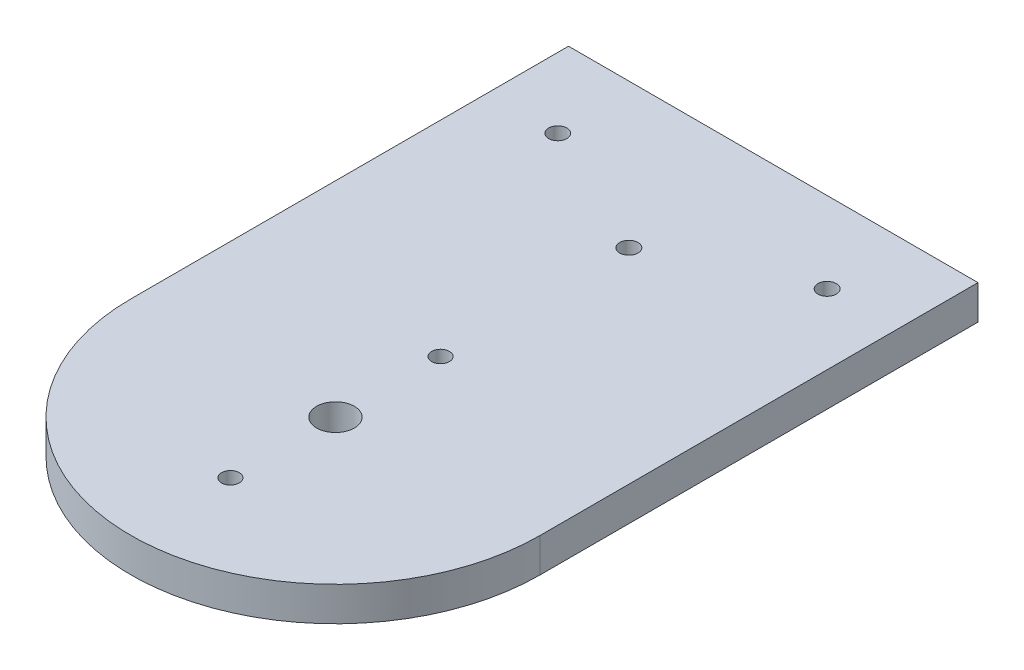
ISO-10303-21;
HEADER;
FILE_DESCRIPTION(('STEP AP214'),'2;1');
FILE_NAME('part.step','',(''),(''),'','','');
FILE_SCHEMA(('AUTOMOTIVE_DESIGN { 1 0 10303 214 1 1 1 1 }'));
ENDSEC;
DATA;
#1=APPLICATION_CONTEXT('core data for automotive mechanical design processes');
#2=APPLICATION_PROTOCOL_DEFINITION('international standard','automotive_design',2000,#1);
#3=PRODUCT_CONTEXT('',#1,'mechanical');
#4=PRODUCT('Part','Part','',(#3));
#5=PRODUCT_RELATED_PRODUCT_CATEGORY('part','',(#4));
#6=PRODUCT_DEFINITION_FORMATION('','',#4);
#7=PRODUCT_DEFINITION_CONTEXT('part definition',#1,'design');
#8=PRODUCT_DEFINITION('design','',#6,#7);
#9=PRODUCT_DEFINITION_SHAPE('','',#8);
#10=(LENGTH_UNIT() NAMED_UNIT(*) SI_UNIT(.MILLI.,.METRE.));
#11=(NAMED_UNIT(*) PLANE_ANGLE_UNIT() SI_UNIT($,.RADIAN.));
#12=(NAMED_UNIT(*) SI_UNIT($,.STERADIAN.) SOLID_ANGLE_UNIT());
#13=UNCERTAINTY_MEASURE_WITH_UNIT(LENGTH_MEASURE(1.E-05),#10,'distance_accuracy_value','');
#14=(GEOMETRIC_REPRESENTATION_CONTEXT(3) GLOBAL_UNCERTAINTY_ASSIGNED_CONTEXT((#13)) GLOBAL_UNIT_ASSIGNED_CONTEXT((#10,
#11,#12)) REPRESENTATION_CONTEXT('',''));
#15=CARTESIAN_POINT('',(0.,0.,0.));
#16=DIRECTION('',(0.,0.,1.));
#17=DIRECTION('',(1.,0.,0.));
#18=AXIS2_PLACEMENT_3D('',#15,#16,#17);
#19=CARTESIAN_POINT('',(-38.,-15.,90.2));
#20=DIRECTION('',(1.,0.,0.));
#21=DIRECTION('',(0.,0.,-1.));
#22=AXIS2_PLACEMENT_3D('',#19,#20,#21);
#23=PLANE('',#22);
#24=DIRECTION('',(0.,0.,1.));
#25=VECTOR('',#24,1.);
#26=CARTESIAN_POINT('',(-38.,-21.35,90.2));
#27=LINE('',#26,#25);
#28=CARTESIAN_POINT('',(-38.,-21.35,90.2));
#29=VERTEX_POINT('',#28);
#30=CARTESIAN_POINT('',(-38.,-21.35,171.45));
#31=VERTEX_POINT('',#30);
#32=EDGE_CURVE('E89',#29,#31,#27,.T.);
#33=ORIENTED_EDGE('',*,*,#32,.T.);
#34=DIRECTION('',(0.,-1.,0.));
#35=VECTOR('',#34,1.);
#36=CARTESIAN_POINT('',(-38.,-15.,171.45));
#37=LINE('',#36,#35);
#38=CARTESIAN_POINT('',(-38.,-15.,171.45));
#39=VERTEX_POINT('',#38);
#40=EDGE_CURVE('E11',#39,#31,#37,.T.);
#41=ORIENTED_EDGE('',*,*,#40,.F.);
#42=DIRECTION('',(0.,0.,1.));
#43=VECTOR('',#42,1.);
#44=CARTESIAN_POINT('',(-38.,-15.,90.2));
#45=LINE('',#44,#43);
#46=CARTESIAN_POINT('',(-38.,-15.,90.2));
#47=VERTEX_POINT('',#46);
#48=EDGE_CURVE('E84',#47,#39,#45,.T.);
#49=ORIENTED_EDGE('',*,*,#48,.F.);
#50=DIRECTION('',(0.,-1.,0.));
#51=VECTOR('',#50,1.);
#52=CARTESIAN_POINT('',(-38.,-15.,90.2));
#53=LINE('',#52,#51);
#54=EDGE_CURVE('E80',#47,#29,#53,.T.);
#55=ORIENTED_EDGE('',*,*,#54,.T.);
#56=EDGE_LOOP('',(#33,#41,#49,#55));
#57=FACE_BOUND('',#56,.T.);
#58=ADVANCED_FACE('F39',(#57),#23,.F.);
#59=CARTESIAN_POINT('',(38.,-15.,90.2));
#60=DIRECTION('',(-1.,0.,0.));
#61=DIRECTION('',(0.,0.,1.));
#62=AXIS2_PLACEMENT_3D('',#59,#60,#61);
#63=PLANE('',#62);
#64=DIRECTION('',(0.,0.,-1.));
#65=VECTOR('',#64,1.);
#66=CARTESIAN_POINT('',(38.,-21.35,90.2));
#67=LINE('',#66,#65);
#68=CARTESIAN_POINT('',(38.,-21.35,171.45));
#69=VERTEX_POINT('',#68);
#70=CARTESIAN_POINT('',(38.,-21.35,90.2));
#71=VERTEX_POINT('',#70);
#72=EDGE_CURVE('E66',#69,#71,#67,.T.);
#73=ORIENTED_EDGE('',*,*,#72,.T.);
#74=DIRECTION('',(0.,-1.,0.));
#75=VECTOR('',#74,1.);
#76=CARTESIAN_POINT('',(38.,-15.,90.2));
#77=LINE('',#76,#75);
#78=CARTESIAN_POINT('',(38.,-15.,90.2));
#79=VERTEX_POINT('',#78);
#80=EDGE_CURVE('E79',#79,#71,#77,.T.);
#81=ORIENTED_EDGE('',*,*,#80,.F.);
#82=DIRECTION('',(0.,0.,-1.));
#83=VECTOR('',#82,1.);
#84=CARTESIAN_POINT('',(38.,-15.,90.2));
#85=LINE('',#84,#83);
#86=CARTESIAN_POINT('',(38.,-15.,171.45));
#87=VERTEX_POINT('',#86);
#88=EDGE_CURVE('E104',#87,#79,#85,.T.);
#89=ORIENTED_EDGE('',*,*,#88,.F.);
#90=DIRECTION('',(0.,-1.,0.));
#91=VECTOR('',#90,1.);
#92=CARTESIAN_POINT('',(38.,-15.,171.45));
#93=LINE('',#92,#91);
#94=EDGE_CURVE('E50',#87,#69,#93,.T.);
#95=ORIENTED_EDGE('',*,*,#94,.T.);
#96=EDGE_LOOP('',(#73,#81,#89,#95));
#97=FACE_BOUND('',#96,.T.);
#98=ADVANCED_FACE('F105',(#97),#63,.F.);
#99=CARTESIAN_POINT('',(-38.,-15.,90.2));
#100=DIRECTION('',(0.,0.,1.));
#101=DIRECTION('',(1.,0.,0.));
#102=AXIS2_PLACEMENT_3D('',#99,#100,#101);
#103=PLANE('',#102);
#104=CARTESIAN_POINT('',(-30.,-18.175,90.2));
#105=DIRECTION('',(0.,0.,1.));
#106=DIRECTION('',(1.,0.,0.));
#107=AXIS2_PLACEMENT_3D('',#104,#105,#106);
#108=CIRCLE('',#107,2.);
#109=CARTESIAN_POINT('',(-28.,-18.175,90.2));
#110=VERTEX_POINT('',#109);
#111=EDGE_CURVE('E142',#110,#110,#108,.T.);
#112=ORIENTED_EDGE('',*,*,#111,.T.);
#113=EDGE_LOOP('',(#112));
#114=FACE_BOUND('',#113,.T.);
#115=CARTESIAN_POINT('',(30.,-18.175,90.2));
#116=DIRECTION('',(0.,0.,1.));
#117=DIRECTION('',(1.,0.,0.));
#118=AXIS2_PLACEMENT_3D('',#115,#116,#117);
#119=CIRCLE('',#118,2.);
#120=CARTESIAN_POINT('',(32.,-18.175,90.2));
#121=VERTEX_POINT('',#120);
#122=EDGE_CURVE('E140',#121,#121,#119,.T.);
#123=ORIENTED_EDGE('',*,*,#122,.T.);
#124=EDGE_LOOP('',(#123));
#125=FACE_BOUND('',#124,.T.);
#126=DIRECTION('',(-1.,0.,0.));
#127=VECTOR('',#126,1.);
#128=CARTESIAN_POINT('',(-38.,-21.35,90.2));
#129=LINE('',#128,#127);
#130=EDGE_CURVE('E72',#71,#29,#129,.T.);
#131=ORIENTED_EDGE('',*,*,#130,.T.);
#132=ORIENTED_EDGE('',*,*,#54,.F.);
#133=DIRECTION('',(-1.,0.,0.));
#134=VECTOR('',#133,1.);
#135=CARTESIAN_POINT('',(-38.,-15.,90.2));
#136=LINE('',#135,#134);
#137=EDGE_CURVE('E54',#79,#47,#136,.T.);
#138=ORIENTED_EDGE('',*,*,#137,.F.);
#139=ORIENTED_EDGE('',*,*,#80,.T.);
#140=EDGE_LOOP('',(#131,#132,#138,#139));
#141=FACE_BOUND('',#140,.T.);
#142=ADVANCED_FACE('F77',(#114,#125,#141),#103,.F.);
#143=CARTESIAN_POINT('',(0.,-15.,0.));
#144=DIRECTION('',(0.,1.,0.));
#145=DIRECTION('',(0.,0.,1.));
#146=AXIS2_PLACEMENT_3D('',#143,#144,#145);
#147=PLANE('',#146);
#148=CARTESIAN_POINT('',(0.,-15.,117.));
#149=DIRECTION('',(0.,1.,0.));
#150=DIRECTION('',(0.,0.,1.));
#151=AXIS2_PLACEMENT_3D('',#148,#149,#150);
#152=CIRCLE('',#151,1.7);
#153=CARTESIAN_POINT('',(0.,-15.,118.7));
#154=VERTEX_POINT('',#153);
#155=EDGE_CURVE('E146',#154,#154,#152,.T.);
#156=ORIENTED_EDGE('',*,*,#155,.F.);
#157=EDGE_LOOP('',(#156));
#158=FACE_BOUND('',#157,.T.);
#159=CARTESIAN_POINT('',(-25.,-15.,105.2));
#160=DIRECTION('',(0.,1.,0.));
#161=DIRECTION('',(0.,0.,1.));
#162=AXIS2_PLACEMENT_3D('',#159,#160,#161);
#163=CIRCLE('',#162,1.7);
#164=CARTESIAN_POINT('',(-25.,-15.,106.9));
#165=VERTEX_POINT('',#164);
#166=EDGE_CURVE('E138',#165,#165,#163,.T.);
#167=ORIENTED_EDGE('',*,*,#166,.F.);
#168=EDGE_LOOP('',(#167));
#169=FACE_BOUND('',#168,.T.);
#170=CARTESIAN_POINT('',(25.,-15.,105.2));
#171=DIRECTION('',(0.,1.,0.));
#172=DIRECTION('',(0.,0.,1.));
#173=AXIS2_PLACEMENT_3D('',#170,#171,#172);
#174=CIRCLE('',#173,1.7);
#175=CARTESIAN_POINT('',(25.,-15.,106.9));
#176=VERTEX_POINT('',#175);
#177=EDGE_CURVE('E148',#176,#176,#174,.T.);
#178=ORIENTED_EDGE('',*,*,#177,.F.);
#179=EDGE_LOOP('',(#178));
#180=FACE_BOUND('',#179,.T.);
#181=CARTESIAN_POINT('',(0.,-15.,151.95));
#182=DIRECTION('',(0.,1.,0.));
#183=DIRECTION('',(0.,0.,1.));
#184=AXIS2_PLACEMENT_3D('',#181,#182,#183);
#185=CIRCLE('',#184,1.65);
#186=CARTESIAN_POINT('',(0.,-15.,153.6));
#187=VERTEX_POINT('',#186);
#188=EDGE_CURVE('E125',#187,#187,#185,.T.);
#189=ORIENTED_EDGE('',*,*,#188,.F.);
#190=EDGE_LOOP('',(#189));
#191=FACE_BOUND('',#190,.T.);
#192=CARTESIAN_POINT('',(0.,-15.,190.95));
#193=DIRECTION('',(0.,1.,0.));
#194=DIRECTION('',(0.,0.,1.));
#195=AXIS2_PLACEMENT_3D('',#192,#193,#194);
#196=CIRCLE('',#195,1.65);
#197=CARTESIAN_POINT('',(0.,-15.,192.6));
#198=VERTEX_POINT('',#197);
#199=EDGE_CURVE('E130',#198,#198,#196,.T.);
#200=ORIENTED_EDGE('',*,*,#199,.F.);
#201=EDGE_LOOP('',(#200));
#202=FACE_BOUND('',#201,.T.);
#203=CARTESIAN_POINT('',(0.,-15.,171.45));
#204=DIRECTION('',(0.,1.,0.));
#205=DIRECTION('',(0.,0.,1.));
#206=AXIS2_PLACEMENT_3D('',#203,#204,#205);
#207=CIRCLE('',#206,3.5);
#208=CARTESIAN_POINT('',(0.,-15.,174.95));
#209=VERTEX_POINT('',#208);
#210=EDGE_CURVE('E112',#209,#209,#207,.T.);
#211=ORIENTED_EDGE('',*,*,#210,.F.);
#212=EDGE_LOOP('',(#211));
#213=FACE_BOUND('',#212,.T.);
#214=ORIENTED_EDGE('',*,*,#48,.T.);
#215=CARTESIAN_POINT('',(0.,-15.,171.45));
#216=DIRECTION('',(0.,1.,0.));
#217=DIRECTION('',(0.,0.,1.));
#218=AXIS2_PLACEMENT_3D('',#215,#216,#217);
#219=CIRCLE('',#218,38.);
#220=EDGE_CURVE('E95',#39,#87,#219,.T.);
#221=ORIENTED_EDGE('',*,*,#220,.T.);
#222=ORIENTED_EDGE('',*,*,#88,.T.);
#223=ORIENTED_EDGE('',*,*,#137,.T.);
#224=EDGE_LOOP('',(#214,#221,#222,#223));
#225=FACE_BOUND('',#224,.T.);
#226=ADVANCED_FACE('F109',(#158,#169,#180,#191,#202,#213,#225),#147,.T.);
#227=CARTESIAN_POINT('',(0.,-21.35,0.));
#228=DIRECTION('',(0.,1.,0.));
#229=DIRECTION('',(0.,0.,1.));
#230=AXIS2_PLACEMENT_3D('',#227,#228,#229);
#231=PLANE('',#230);
#232=CARTESIAN_POINT('',(0.,-21.35,117.));
#233=DIRECTION('',(0.,1.,0.));
#234=DIRECTION('',(0.,0.,1.));
#235=AXIS2_PLACEMENT_3D('',#232,#233,#234);
#236=CIRCLE('',#235,1.7);
#237=CARTESIAN_POINT('',(0.,-21.35,118.7));
#238=VERTEX_POINT('',#237);
#239=EDGE_CURVE('E158',#238,#238,#236,.T.);
#240=ORIENTED_EDGE('',*,*,#239,.T.);
#241=EDGE_LOOP('',(#240));
#242=FACE_BOUND('',#241,.T.);
#243=CARTESIAN_POINT('',(-25.,-21.35,105.2));
#244=DIRECTION('',(0.,1.,0.));
#245=DIRECTION('',(0.,0.,1.));
#246=AXIS2_PLACEMENT_3D('',#243,#244,#245);
#247=CIRCLE('',#246,1.7);
#248=CARTESIAN_POINT('',(-25.,-21.35,106.9));
#249=VERTEX_POINT('',#248);
#250=EDGE_CURVE('E155',#249,#249,#247,.T.);
#251=ORIENTED_EDGE('',*,*,#250,.T.);
#252=EDGE_LOOP('',(#251));
#253=FACE_BOUND('',#252,.T.);
#254=CARTESIAN_POINT('',(25.,-21.35,105.2));
#255=DIRECTION('',(0.,1.,0.));
#256=DIRECTION('',(0.,0.,1.));
#257=AXIS2_PLACEMENT_3D('',#254,#255,#256);
#258=CIRCLE('',#257,1.7);
#259=CARTESIAN_POINT('',(25.,-21.35,106.9));
#260=VERTEX_POINT('',#259);
#261=EDGE_CURVE('E150',#260,#260,#258,.T.);
#262=ORIENTED_EDGE('',*,*,#261,.T.);
#263=EDGE_LOOP('',(#262));
#264=FACE_BOUND('',#263,.T.);
#265=CARTESIAN_POINT('',(0.,-21.35,151.95));
#266=DIRECTION('',(0.,1.,0.));
#267=DIRECTION('',(0.,0.,1.));
#268=AXIS2_PLACEMENT_3D('',#265,#266,#267);
#269=CIRCLE('',#268,1.65);
#270=CARTESIAN_POINT('',(0.,-21.35,153.6));
#271=VERTEX_POINT('',#270);
#272=EDGE_CURVE('E123',#271,#271,#269,.T.);
#273=ORIENTED_EDGE('',*,*,#272,.T.);
#274=EDGE_LOOP('',(#273));
#275=FACE_BOUND('',#274,.T.);
#276=CARTESIAN_POINT('',(0.,-21.35,190.95));
#277=DIRECTION('',(0.,1.,0.));
#278=DIRECTION('',(0.,0.,1.));
#279=AXIS2_PLACEMENT_3D('',#276,#277,#278);
#280=CIRCLE('',#279,1.65);
#281=CARTESIAN_POINT('',(0.,-21.35,192.6));
#282=VERTEX_POINT('',#281);
#283=EDGE_CURVE('E118',#282,#282,#280,.T.);
#284=ORIENTED_EDGE('',*,*,#283,.T.);
#285=EDGE_LOOP('',(#284));
#286=FACE_BOUND('',#285,.T.);
#287=CARTESIAN_POINT('',(0.,-21.35,171.45));
#288=DIRECTION('',(0.,1.,0.));
#289=DIRECTION('',(0.,0.,1.));
#290=AXIS2_PLACEMENT_3D('',#287,#288,#289);
#291=CIRCLE('',#290,3.5);
#292=CARTESIAN_POINT('',(0.,-21.35,174.95));
#293=VERTEX_POINT('',#292);
#294=EDGE_CURVE('E116',#293,#293,#291,.T.);
#295=ORIENTED_EDGE('',*,*,#294,.T.);
#296=EDGE_LOOP('',(#295));
#297=FACE_BOUND('',#296,.T.);
#298=ORIENTED_EDGE('',*,*,#72,.F.);
#299=CARTESIAN_POINT('',(0.,-21.35,171.45));
#300=DIRECTION('',(0.,1.,0.));
#301=DIRECTION('',(0.,0.,1.));
#302=AXIS2_PLACEMENT_3D('',#299,#300,#301);
#303=CIRCLE('',#302,38.);
#304=EDGE_CURVE('E91',#31,#69,#303,.T.);
#305=ORIENTED_EDGE('',*,*,#304,.F.);
#306=ORIENTED_EDGE('',*,*,#32,.F.);
#307=ORIENTED_EDGE('',*,*,#130,.F.);
#308=EDGE_LOOP('',(#298,#305,#306,#307));
#309=FACE_BOUND('',#308,.T.);
#310=ADVANCED_FACE('F88',(#242,#253,#264,#275,#286,#297,#309),#231,.F.);
#311=CARTESIAN_POINT('',(0.,-15.,171.45));
#312=DIRECTION('',(0.,-1.,0.));
#313=DIRECTION('',(0.,0.,-1.));
#314=AXIS2_PLACEMENT_3D('',#311,#312,#313);
#315=CYLINDRICAL_SURFACE('',#314,38.);
#316=ORIENTED_EDGE('',*,*,#220,.F.);
#317=ORIENTED_EDGE('',*,*,#40,.T.);
#318=ORIENTED_EDGE('',*,*,#304,.T.);
#319=ORIENTED_EDGE('',*,*,#94,.F.);
#320=EDGE_LOOP('',(#316,#317,#318,#319));
#321=FACE_BOUND('',#320,.T.);
#322=ADVANCED_FACE('F110',(#321),#315,.T.);
#323=CARTESIAN_POINT('',(0.,-15.,171.45));
#324=DIRECTION('',(0.,-1.,0.));
#325=DIRECTION('',(0.,0.,-1.));
#326=AXIS2_PLACEMENT_3D('',#323,#324,#325);
#327=CYLINDRICAL_SURFACE('',#326,3.5);
#328=ORIENTED_EDGE('',*,*,#210,.T.);
#329=EDGE_LOOP('',(#328));
#330=FACE_BOUND('',#329,.T.);
#331=ORIENTED_EDGE('',*,*,#294,.F.);
#332=EDGE_LOOP('',(#331));
#333=FACE_BOUND('',#332,.T.);
#334=ADVANCED_FACE('F179',(#330,#333),#327,.F.);
#335=CARTESIAN_POINT('',(0.,-15.,190.95));
#336=DIRECTION('',(0.,-1.,0.));
#337=DIRECTION('',(0.,0.,-1.));
#338=AXIS2_PLACEMENT_3D('',#335,#336,#337);
#339=CYLINDRICAL_SURFACE('',#338,1.65);
#340=ORIENTED_EDGE('',*,*,#199,.T.);
#341=EDGE_LOOP('',(#340));
#342=FACE_BOUND('',#341,.T.);
#343=ORIENTED_EDGE('',*,*,#283,.F.);
#344=EDGE_LOOP('',(#343));
#345=FACE_BOUND('',#344,.T.);
#346=ADVANCED_FACE('F182',(#342,#345),#339,.F.);
#347=CARTESIAN_POINT('',(0.,-15.,151.95));
#348=DIRECTION('',(0.,-1.,0.));
#349=DIRECTION('',(0.,0.,-1.));
#350=AXIS2_PLACEMENT_3D('',#347,#348,#349);
#351=CYLINDRICAL_SURFACE('',#350,1.65);
#352=ORIENTED_EDGE('',*,*,#188,.T.);
#353=EDGE_LOOP('',(#352));
#354=FACE_BOUND('',#353,.T.);
#355=ORIENTED_EDGE('',*,*,#272,.F.);
#356=EDGE_LOOP('',(#355));
#357=FACE_BOUND('',#356,.T.);
#358=ADVANCED_FACE('F211',(#354,#357),#351,.F.);
#359=CARTESIAN_POINT('',(30.,-18.175,98.2));
#360=DIRECTION('',(0.,0.,-1.));
#361=DIRECTION('',(-1.,0.,0.));
#362=AXIS2_PLACEMENT_3D('',#359,#360,#361);
#363=CYLINDRICAL_SURFACE('',#362,2.);
#364=CARTESIAN_POINT('',(30.,-18.175,98.2));
#365=DIRECTION('',(0.,0.,1.));
#366=DIRECTION('',(1.,0.,0.));
#367=AXIS2_PLACEMENT_3D('',#364,#365,#366);
#368=CIRCLE('',#367,2.);
#369=CARTESIAN_POINT('',(32.,-18.175,98.2));
#370=VERTEX_POINT('',#369);
#371=EDGE_CURVE('E131',#370,#370,#368,.T.);
#372=ORIENTED_EDGE('',*,*,#371,.T.);
#373=EDGE_LOOP('',(#372));
#374=FACE_BOUND('',#373,.T.);
#375=ORIENTED_EDGE('',*,*,#122,.F.);
#376=EDGE_LOOP('',(#375));
#377=FACE_BOUND('',#376,.T.);
#378=ADVANCED_FACE('F212',(#374,#377),#363,.F.);
#379=CARTESIAN_POINT('',(30.,-18.175,98.2));
#380=DIRECTION('',(0.,0.,1.));
#381=DIRECTION('',(1.,0.,0.));
#382=AXIS2_PLACEMENT_3D('',#379,#380,#381);
#383=PLANE('',#382);
#384=ORIENTED_EDGE('',*,*,#371,.F.);
#385=EDGE_LOOP('',(#384));
#386=FACE_BOUND('',#385,.T.);
#387=ADVANCED_FACE('F215',(#386),#383,.F.);
#388=CARTESIAN_POINT('',(-30.,-18.175,98.2));
#389=DIRECTION('',(0.,0.,-1.));
#390=DIRECTION('',(-1.,0.,0.));
#391=AXIS2_PLACEMENT_3D('',#388,#389,#390);
#392=CYLINDRICAL_SURFACE('',#391,2.);
#393=CARTESIAN_POINT('',(-30.,-18.175,98.2));
#394=DIRECTION('',(0.,0.,1.));
#395=DIRECTION('',(1.,0.,0.));
#396=AXIS2_PLACEMENT_3D('',#393,#394,#395);
#397=CIRCLE('',#396,2.);
#398=CARTESIAN_POINT('',(-28.,-18.175,98.2));
#399=VERTEX_POINT('',#398);
#400=EDGE_CURVE('E128',#399,#399,#397,.T.);
#401=ORIENTED_EDGE('',*,*,#400,.T.);
#402=EDGE_LOOP('',(#401));
#403=FACE_BOUND('',#402,.T.);
#404=ORIENTED_EDGE('',*,*,#111,.F.);
#405=EDGE_LOOP('',(#404));
#406=FACE_BOUND('',#405,.T.);
#407=ADVANCED_FACE('F221',(#403,#406),#392,.F.);
#408=CARTESIAN_POINT('',(-30.,-18.175,98.2));
#409=DIRECTION('',(0.,0.,1.));
#410=DIRECTION('',(1.,0.,0.));
#411=AXIS2_PLACEMENT_3D('',#408,#409,#410);
#412=PLANE('',#411);
#413=ORIENTED_EDGE('',*,*,#400,.F.);
#414=EDGE_LOOP('',(#413));
#415=FACE_BOUND('',#414,.T.);
#416=ADVANCED_FACE('F265',(#415),#412,.F.);
#417=CARTESIAN_POINT('',(25.,-15.,105.2));
#418=DIRECTION('',(0.,-1.,0.));
#419=DIRECTION('',(0.,0.,-1.));
#420=AXIS2_PLACEMENT_3D('',#417,#418,#419);
#421=CYLINDRICAL_SURFACE('',#420,1.7);
#422=ORIENTED_EDGE('',*,*,#177,.T.);
#423=EDGE_LOOP('',(#422));
#424=FACE_BOUND('',#423,.T.);
#425=ORIENTED_EDGE('',*,*,#261,.F.);
#426=EDGE_LOOP('',(#425));
#427=FACE_BOUND('',#426,.T.);
#428=ADVANCED_FACE('F275',(#424,#427),#421,.F.);
#429=CARTESIAN_POINT('',(-25.,-15.,105.2));
#430=DIRECTION('',(0.,-1.,0.));
#431=DIRECTION('',(0.,0.,-1.));
#432=AXIS2_PLACEMENT_3D('',#429,#430,#431);
#433=CYLINDRICAL_SURFACE('',#432,1.7);
#434=ORIENTED_EDGE('',*,*,#166,.T.);
#435=EDGE_LOOP('',(#434));
#436=FACE_BOUND('',#435,.T.);
#437=ORIENTED_EDGE('',*,*,#250,.F.);
#438=EDGE_LOOP('',(#437));
#439=FACE_BOUND('',#438,.T.);
#440=ADVANCED_FACE('F282',(#436,#439),#433,.F.);
#441=CARTESIAN_POINT('',(0.,-15.,117.));
#442=DIRECTION('',(0.,-1.,0.));
#443=DIRECTION('',(0.,0.,-1.));
#444=AXIS2_PLACEMENT_3D('',#441,#442,#443);
#445=CYLINDRICAL_SURFACE('',#444,1.7);
#446=ORIENTED_EDGE('',*,*,#155,.T.);
#447=EDGE_LOOP('',(#446));
#448=FACE_BOUND('',#447,.T.);
#449=ORIENTED_EDGE('',*,*,#239,.F.);
#450=EDGE_LOOP('',(#449));
#451=FACE_BOUND('',#450,.T.);
#452=ADVANCED_FACE('F165',(#448,#451),#445,.F.);
#453=CLOSED_SHELL('',(#58,#98,#142,#226,#310,#322,#334,#346,#358,#378,#387,#407,#416,#428,#440,#452));
#454=MANIFOLD_SOLID_BREP('B2',#453);
#455=ADVANCED_BREP_SHAPE_REPRESENTATION('',(#18,#454),#14);
#456=SHAPE_DEFINITION_REPRESENTATION(#9,#455);
ENDSEC;
END-ISO-10303-21;
